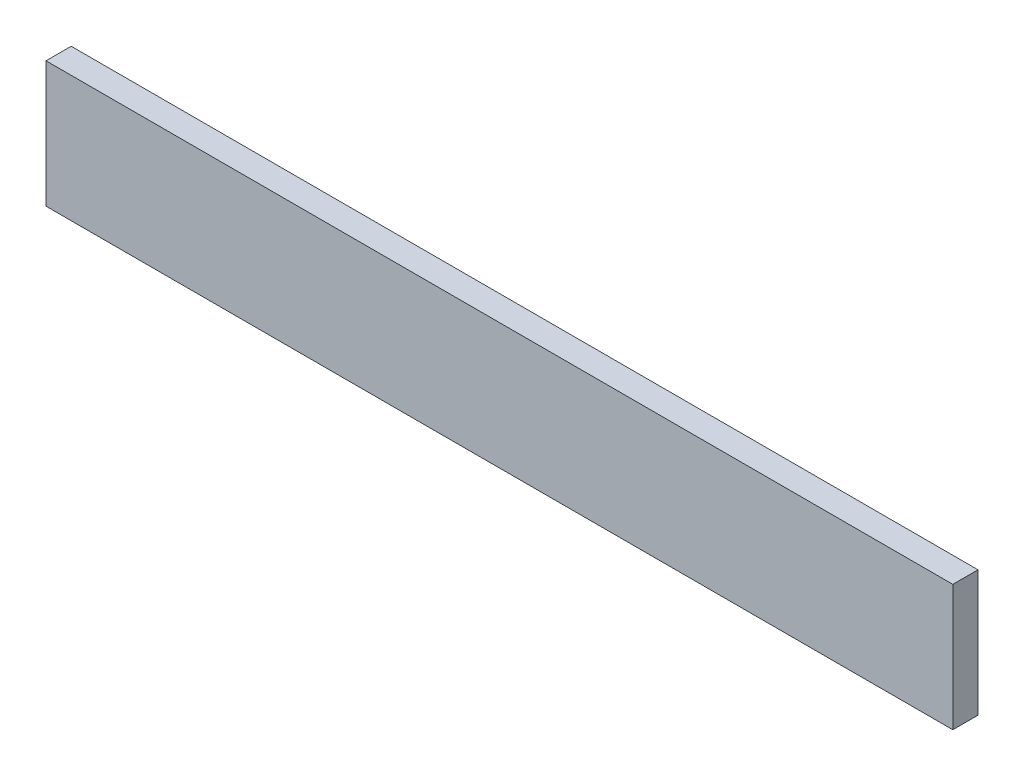
ISO-10303-21;
HEADER;
FILE_DESCRIPTION(('STEP AP214'),'2;1');
FILE_NAME('part.step','',(''),(''),'','','');
FILE_SCHEMA(('AUTOMOTIVE_DESIGN { 1 0 10303 214 1 1 1 1 }'));
ENDSEC;
DATA;
#1=APPLICATION_CONTEXT('core data for automotive mechanical design processes');
#2=APPLICATION_PROTOCOL_DEFINITION('international standard','automotive_design',2000,#1);
#3=PRODUCT_CONTEXT('',#1,'mechanical');
#4=PRODUCT('Part','Part','',(#3));
#5=PRODUCT_RELATED_PRODUCT_CATEGORY('part','',(#4));
#6=PRODUCT_DEFINITION_FORMATION('','',#4);
#7=PRODUCT_DEFINITION_CONTEXT('part definition',#1,'design');
#8=PRODUCT_DEFINITION('design','',#6,#7);
#9=PRODUCT_DEFINITION_SHAPE('','',#8);
#10=(LENGTH_UNIT() NAMED_UNIT(*) SI_UNIT(.MILLI.,.METRE.));
#11=(NAMED_UNIT(*) PLANE_ANGLE_UNIT() SI_UNIT($,.RADIAN.));
#12=(NAMED_UNIT(*) SI_UNIT($,.STERADIAN.) SOLID_ANGLE_UNIT());
#13=UNCERTAINTY_MEASURE_WITH_UNIT(LENGTH_MEASURE(1.E-05),#10,'distance_accuracy_value','');
#14=(GEOMETRIC_REPRESENTATION_CONTEXT(3) GLOBAL_UNCERTAINTY_ASSIGNED_CONTEXT((#13)) GLOBAL_UNIT_ASSIGNED_CONTEXT((#10,
#11,#12)) REPRESENTATION_CONTEXT('',''));
#15=CARTESIAN_POINT('',(0.,0.,0.));
#16=DIRECTION('',(0.,0.,1.));
#17=DIRECTION('',(1.,0.,0.));
#18=AXIS2_PLACEMENT_3D('',#15,#16,#17);
#19=CARTESIAN_POINT('',(0.,0.,15.));
#20=DIRECTION('',(1.,0.,0.));
#21=DIRECTION('',(0.,0.,-1.));
#22=AXIS2_PLACEMENT_3D('',#19,#20,#21);
#23=PLANE('',#22);
#24=DIRECTION('',(0.,-1.,0.));
#25=VECTOR('',#24,1.);
#26=CARTESIAN_POINT('',(0.,0.,0.));
#27=LINE('',#26,#25);
#28=CARTESIAN_POINT('',(0.,75.,0.));
#29=VERTEX_POINT('',#28);
#30=CARTESIAN_POINT('',(0.,0.,0.));
#31=VERTEX_POINT('',#30);
#32=EDGE_CURVE('E109',#29,#31,#27,.T.);
#33=ORIENTED_EDGE('',*,*,#32,.T.);
#34=DIRECTION('',(0.,0.,-1.));
#35=VECTOR('',#34,1.);
#36=CARTESIAN_POINT('',(0.,0.,15.));
#37=LINE('',#36,#35);
#38=CARTESIAN_POINT('',(0.,0.,15.));
#39=VERTEX_POINT('',#38);
#40=EDGE_CURVE('E11',#39,#31,#37,.T.);
#41=ORIENTED_EDGE('',*,*,#40,.F.);
#42=DIRECTION('',(0.,-1.,0.));
#43=VECTOR('',#42,1.);
#44=CARTESIAN_POINT('',(0.,0.,15.));
#45=LINE('',#44,#43);
#46=CARTESIAN_POINT('',(0.,75.,15.));
#47=VERTEX_POINT('',#46);
#48=EDGE_CURVE('E97',#47,#39,#45,.T.);
#49=ORIENTED_EDGE('',*,*,#48,.F.);
#50=DIRECTION('',(0.,0.,-1.));
#51=VECTOR('',#50,1.);
#52=CARTESIAN_POINT('',(0.,75.,15.));
#53=LINE('',#52,#51);
#54=EDGE_CURVE('E108',#47,#29,#53,.T.);
#55=ORIENTED_EDGE('',*,*,#54,.T.);
#56=EDGE_LOOP('',(#33,#41,#49,#55));
#57=FACE_BOUND('',#56,.T.);
#58=ADVANCED_FACE('F50',(#57),#23,.F.);
#59=CARTESIAN_POINT('',(0.,0.,15.));
#60=DIRECTION('',(0.,1.,0.));
#61=DIRECTION('',(0.,0.,1.));
#62=AXIS2_PLACEMENT_3D('',#59,#60,#61);
#63=PLANE('',#62);
#64=DIRECTION('',(1.,0.,0.));
#65=VECTOR('',#64,1.);
#66=CARTESIAN_POINT('',(0.,0.,0.));
#67=LINE('',#66,#65);
#68=CARTESIAN_POINT('',(540.,0.,0.));
#69=VERTEX_POINT('',#68);
#70=EDGE_CURVE('E105',#31,#69,#67,.T.);
#71=ORIENTED_EDGE('',*,*,#70,.T.);
#72=DIRECTION('',(0.,0.,-1.));
#73=VECTOR('',#72,1.);
#74=CARTESIAN_POINT('',(540.,0.,15.));
#75=LINE('',#74,#73);
#76=CARTESIAN_POINT('',(540.,0.,15.));
#77=VERTEX_POINT('',#76);
#78=EDGE_CURVE('E54',#77,#69,#75,.T.);
#79=ORIENTED_EDGE('',*,*,#78,.F.);
#80=DIRECTION('',(1.,0.,0.));
#81=VECTOR('',#80,1.);
#82=CARTESIAN_POINT('',(0.,0.,15.));
#83=LINE('',#82,#81);
#84=EDGE_CURVE('E93',#39,#77,#83,.T.);
#85=ORIENTED_EDGE('',*,*,#84,.F.);
#86=ORIENTED_EDGE('',*,*,#40,.T.);
#87=EDGE_LOOP('',(#71,#79,#85,#86));
#88=FACE_BOUND('',#87,.T.);
#89=ADVANCED_FACE('F102',(#88),#63,.F.);
#90=CARTESIAN_POINT('',(540.,0.,15.));
#91=DIRECTION('',(-1.,0.,0.));
#92=DIRECTION('',(0.,0.,1.));
#93=AXIS2_PLACEMENT_3D('',#90,#91,#92);
#94=PLANE('',#93);
#95=DIRECTION('',(0.,1.,0.));
#96=VECTOR('',#95,1.);
#97=CARTESIAN_POINT('',(540.,0.,0.));
#98=LINE('',#97,#96);
#99=CARTESIAN_POINT('',(540.,75.,0.));
#100=VERTEX_POINT('',#99);
#101=EDGE_CURVE('E79',#69,#100,#98,.T.);
#102=ORIENTED_EDGE('',*,*,#101,.T.);
#103=DIRECTION('',(0.,0.,-1.));
#104=VECTOR('',#103,1.);
#105=CARTESIAN_POINT('',(540.,75.,15.));
#106=LINE('',#105,#104);
#107=CARTESIAN_POINT('',(540.,75.,15.));
#108=VERTEX_POINT('',#107);
#109=EDGE_CURVE('E104',#108,#100,#106,.T.);
#110=ORIENTED_EDGE('',*,*,#109,.F.);
#111=DIRECTION('',(0.,1.,0.));
#112=VECTOR('',#111,1.);
#113=CARTESIAN_POINT('',(540.,0.,15.));
#114=LINE('',#113,#112);
#115=EDGE_CURVE('E96',#77,#108,#114,.T.);
#116=ORIENTED_EDGE('',*,*,#115,.F.);
#117=ORIENTED_EDGE('',*,*,#78,.T.);
#118=EDGE_LOOP('',(#102,#110,#116,#117));
#119=FACE_BOUND('',#118,.T.);
#120=ADVANCED_FACE('F101',(#119),#94,.F.);
#121=CARTESIAN_POINT('',(0.,75.,15.));
#122=DIRECTION('',(0.,-1.,0.));
#123=DIRECTION('',(0.,0.,-1.));
#124=AXIS2_PLACEMENT_3D('',#121,#122,#123);
#125=PLANE('',#124);
#126=DIRECTION('',(-1.,0.,0.));
#127=VECTOR('',#126,1.);
#128=CARTESIAN_POINT('',(0.,75.,0.));
#129=LINE('',#128,#127);
#130=EDGE_CURVE('E86',#100,#29,#129,.T.);
#131=ORIENTED_EDGE('',*,*,#130,.T.);
#132=ORIENTED_EDGE('',*,*,#54,.F.);
#133=DIRECTION('',(-1.,0.,0.));
#134=VECTOR('',#133,1.);
#135=CARTESIAN_POINT('',(0.,75.,15.));
#136=LINE('',#135,#134);
#137=EDGE_CURVE('E61',#108,#47,#136,.T.);
#138=ORIENTED_EDGE('',*,*,#137,.F.);
#139=ORIENTED_EDGE('',*,*,#109,.T.);
#140=EDGE_LOOP('',(#131,#132,#138,#139));
#141=FACE_BOUND('',#140,.T.);
#142=ADVANCED_FACE('F120',(#141),#125,.F.);
#143=CARTESIAN_POINT('',(0.,0.,15.));
#144=DIRECTION('',(0.,0.,-1.));
#145=DIRECTION('',(-1.,0.,0.));
#146=AXIS2_PLACEMENT_3D('',#143,#144,#145);
#147=PLANE('',#146);
#148=ORIENTED_EDGE('',*,*,#48,.T.);
#149=ORIENTED_EDGE('',*,*,#84,.T.);
#150=ORIENTED_EDGE('',*,*,#115,.T.);
#151=ORIENTED_EDGE('',*,*,#137,.T.);
#152=EDGE_LOOP('',(#148,#149,#150,#151));
#153=FACE_BOUND('',#152,.T.);
#154=ADVANCED_FACE('F92',(#153),#147,.F.);
#155=CARTESIAN_POINT('',(0.,0.,0.));
#156=DIRECTION('',(0.,0.,-1.));
#157=DIRECTION('',(-1.,0.,0.));
#158=AXIS2_PLACEMENT_3D('',#155,#156,#157);
#159=PLANE('',#158);
#160=ORIENTED_EDGE('',*,*,#32,.F.);
#161=ORIENTED_EDGE('',*,*,#130,.F.);
#162=ORIENTED_EDGE('',*,*,#101,.F.);
#163=ORIENTED_EDGE('',*,*,#70,.F.);
#164=EDGE_LOOP('',(#160,#161,#162,#163));
#165=FACE_BOUND('',#164,.T.);
#166=ADVANCED_FACE('F119',(#165),#159,.T.);
#167=CLOSED_SHELL('',(#58,#89,#120,#142,#154,#166));
#168=MANIFOLD_SOLID_BREP('B2',#167);
#169=ADVANCED_BREP_SHAPE_REPRESENTATION('',(#18,#168),#14);
#170=SHAPE_DEFINITION_REPRESENTATION(#9,#169);
ENDSEC;
END-ISO-10303-21;
